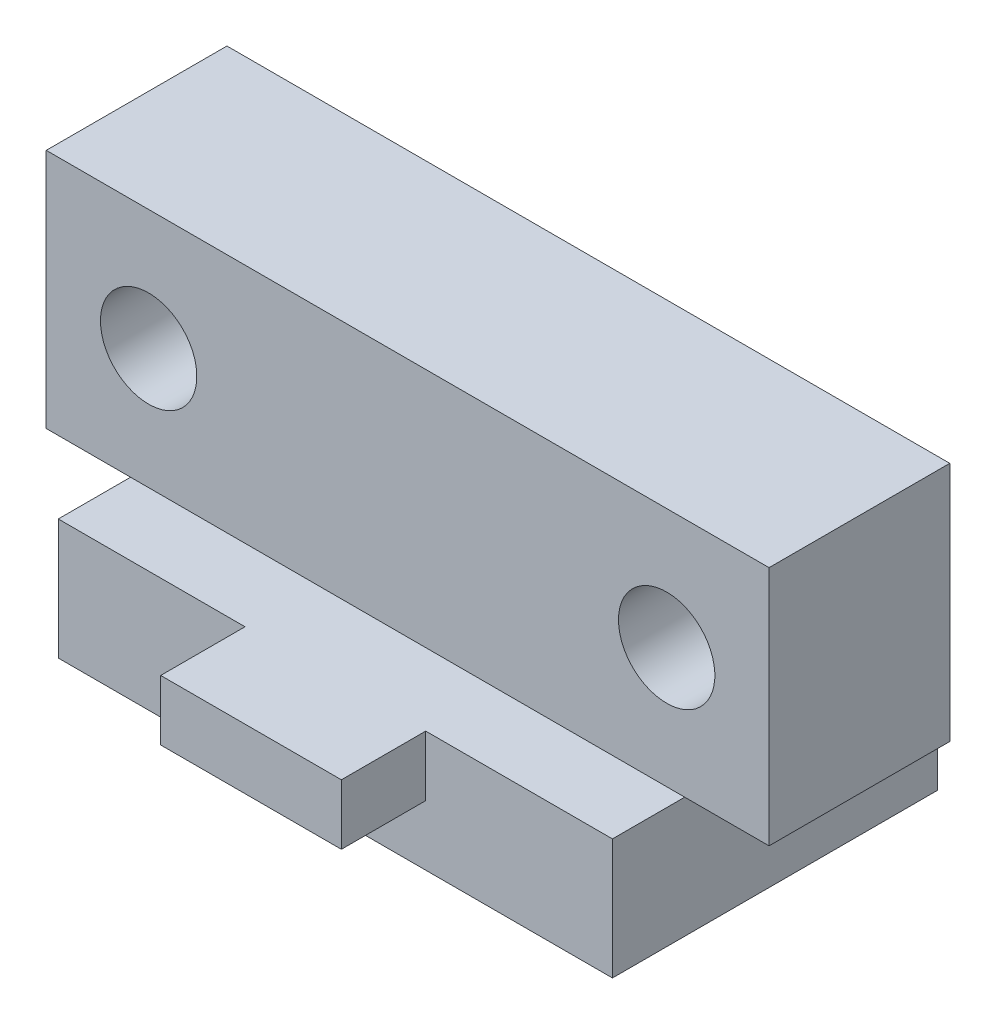
ISO-10303-21;
HEADER;
FILE_DESCRIPTION(('STEP AP214'),'2;1');
FILE_NAME('part.step','',(''),(''),'','','');
FILE_SCHEMA(('AUTOMOTIVE_DESIGN { 1 0 10303 214 1 1 1 1 }'));
ENDSEC;
DATA;
#1=APPLICATION_CONTEXT('core data for automotive mechanical design processes');
#2=APPLICATION_PROTOCOL_DEFINITION('international standard','automotive_design',2000,#1);
#3=PRODUCT_CONTEXT('',#1,'mechanical');
#4=PRODUCT('Part','Part','',(#3));
#5=PRODUCT_RELATED_PRODUCT_CATEGORY('part','',(#4));
#6=PRODUCT_DEFINITION_FORMATION('','',#4);
#7=PRODUCT_DEFINITION_CONTEXT('part definition',#1,'design');
#8=PRODUCT_DEFINITION('design','',#6,#7);
#9=PRODUCT_DEFINITION_SHAPE('','',#8);
#10=(LENGTH_UNIT() NAMED_UNIT(*) SI_UNIT(.MILLI.,.METRE.));
#11=(NAMED_UNIT(*) PLANE_ANGLE_UNIT() SI_UNIT($,.RADIAN.));
#12=(NAMED_UNIT(*) SI_UNIT($,.STERADIAN.) SOLID_ANGLE_UNIT());
#13=UNCERTAINTY_MEASURE_WITH_UNIT(LENGTH_MEASURE(1.E-05),#10,'distance_accuracy_value','');
#14=(GEOMETRIC_REPRESENTATION_CONTEXT(3) GLOBAL_UNCERTAINTY_ASSIGNED_CONTEXT((#13)) GLOBAL_UNIT_ASSIGNED_CONTEXT((#10,
#11,#12)) REPRESENTATION_CONTEXT('',''));
#15=CARTESIAN_POINT('',(0.,0.,0.));
#16=DIRECTION('',(0.,0.,1.));
#17=DIRECTION('',(1.,0.,0.));
#18=AXIS2_PLACEMENT_3D('',#15,#16,#17);
#19=CARTESIAN_POINT('',(0.,10.,0.));
#20=DIRECTION('',(0.,0.,-1.));
#21=DIRECTION('',(-1.,0.,0.));
#22=AXIS2_PLACEMENT_3D('',#19,#20,#21);
#23=PLANE('',#22);
#24=DIRECTION('',(0.,-1.,0.));
#25=VECTOR('',#24,1.);
#26=CARTESIAN_POINT('',(15.5,10.,0.));
#27=LINE('',#26,#25);
#28=CARTESIAN_POINT('',(15.5,10.,0.));
#29=VERTEX_POINT('',#28);
#30=CARTESIAN_POINT('',(15.5,5.,0.));
#31=VERTEX_POINT('',#30);
#32=EDGE_CURVE('E161',#29,#31,#27,.T.);
#33=ORIENTED_EDGE('',*,*,#32,.F.);
#34=DIRECTION('',(1.,0.,0.));
#35=VECTOR('',#34,1.);
#36=CARTESIAN_POINT('',(0.,10.,0.));
#37=LINE('',#36,#35);
#38=CARTESIAN_POINT('',(0.,10.,0.));
#39=VERTEX_POINT('',#38);
#40=EDGE_CURVE('E216',#39,#29,#37,.T.);
#41=ORIENTED_EDGE('',*,*,#40,.F.);
#42=DIRECTION('',(0.,-1.,0.));
#43=VECTOR('',#42,1.);
#44=CARTESIAN_POINT('',(0.,10.,0.));
#45=LINE('',#44,#43);
#46=CARTESIAN_POINT('',(0.,0.,0.));
#47=VERTEX_POINT('',#46);
#48=EDGE_CURVE('E39',#39,#47,#45,.T.);
#49=ORIENTED_EDGE('',*,*,#48,.T.);
#50=DIRECTION('',(1.,0.,0.));
#51=VECTOR('',#50,1.);
#52=CARTESIAN_POINT('',(0.,0.,0.));
#53=LINE('',#52,#51);
#54=CARTESIAN_POINT('',(46.,0.,0.));
#55=VERTEX_POINT('',#54);
#56=EDGE_CURVE('E228',#47,#55,#53,.T.);
#57=ORIENTED_EDGE('',*,*,#56,.T.);
#58=DIRECTION('',(0.,-1.,0.));
#59=VECTOR('',#58,1.);
#60=CARTESIAN_POINT('',(46.,10.,0.));
#61=LINE('',#60,#59);
#62=CARTESIAN_POINT('',(46.,10.,0.));
#63=VERTEX_POINT('',#62);
#64=EDGE_CURVE('E238',#63,#55,#61,.T.);
#65=ORIENTED_EDGE('',*,*,#64,.F.);
#66=CARTESIAN_POINT('',(30.5,10.,0.));
#67=VERTEX_POINT('',#66);
#68=EDGE_CURVE('E60',#67,#63,#37,.T.);
#69=ORIENTED_EDGE('',*,*,#68,.F.);
#70=DIRECTION('',(0.,1.,0.));
#71=VECTOR('',#70,1.);
#72=CARTESIAN_POINT('',(30.5,10.,0.));
#73=LINE('',#72,#71);
#74=CARTESIAN_POINT('',(30.5,5.00000000000001,0.));
#75=VERTEX_POINT('',#74);
#76=EDGE_CURVE('E158',#75,#67,#73,.T.);
#77=ORIENTED_EDGE('',*,*,#76,.F.);
#78=DIRECTION('',(1.,0.,0.));
#79=VECTOR('',#78,1.);
#80=CARTESIAN_POINT('',(15.5,5.,0.));
#81=LINE('',#80,#79);
#82=EDGE_CURVE('E54',#31,#75,#81,.T.);
#83=ORIENTED_EDGE('',*,*,#82,.F.);
#84=EDGE_LOOP('',(#33,#41,#49,#57,#65,#69,#77,#83));
#85=FACE_BOUND('',#84,.T.);
#86=ADVANCED_FACE('F35',(#85),#23,.F.);
#87=CARTESIAN_POINT('',(0.,10.,0.));
#88=DIRECTION('',(0.,-1.,0.));
#89=DIRECTION('',(0.,0.,-1.));
#90=AXIS2_PLACEMENT_3D('',#87,#88,#89);
#91=PLANE('',#90);
#92=DIRECTION('',(-1.,0.,0.));
#93=VECTOR('',#92,1.);
#94=CARTESIAN_POINT('',(-7.,10.,-21.));
#95=LINE('',#94,#93);
#96=CARTESIAN_POINT('',(46.,10.,-21.));
#97=VERTEX_POINT('',#96);
#98=CARTESIAN_POINT('',(0.,10.,-21.));
#99=VERTEX_POINT('',#98);
#100=EDGE_CURVE('E11',#97,#99,#95,.T.);
#101=ORIENTED_EDGE('',*,*,#100,.F.);
#102=DIRECTION('',(0.,0.,-1.));
#103=VECTOR('',#102,1.);
#104=CARTESIAN_POINT('',(46.,10.,0.));
#105=LINE('',#104,#103);
#106=CARTESIAN_POINT('',(46.,10.,-27.));
#107=VERTEX_POINT('',#106);
#108=EDGE_CURVE('E219',#97,#107,#105,.T.);
#109=ORIENTED_EDGE('',*,*,#108,.T.);
#110=DIRECTION('',(-1.,0.,0.));
#111=VECTOR('',#110,1.);
#112=CARTESIAN_POINT('',(0.,10.,-27.));
#113=LINE('',#112,#111);
#114=CARTESIAN_POINT('',(0.,10.,-27.));
#115=VERTEX_POINT('',#114);
#116=EDGE_CURVE('E222',#107,#115,#113,.T.);
#117=ORIENTED_EDGE('',*,*,#116,.T.);
#118=DIRECTION('',(0.,0.,1.));
#119=VECTOR('',#118,1.);
#120=CARTESIAN_POINT('',(0.,10.,0.));
#121=LINE('',#120,#119);
#122=EDGE_CURVE('E211',#115,#99,#121,.T.);
#123=ORIENTED_EDGE('',*,*,#122,.T.);
#124=EDGE_LOOP('',(#101,#109,#117,#123));
#125=FACE_BOUND('',#124,.T.);
#126=ADVANCED_FACE('F308',(#125),#91,.F.);
#127=DIRECTION('',(1.,0.,0.));
#128=VECTOR('',#127,1.);
#129=CARTESIAN_POINT('',(-7.,10.,-6.));
#130=LINE('',#129,#128);
#131=CARTESIAN_POINT('',(0.,10.,-6.));
#132=VERTEX_POINT('',#131);
#133=CARTESIAN_POINT('',(46.,10.,-6.));
#134=VERTEX_POINT('',#133);
#135=EDGE_CURVE('E44',#132,#134,#130,.T.);
#136=ORIENTED_EDGE('',*,*,#135,.F.);
#137=EDGE_CURVE('E215',#132,#39,#121,.T.);
#138=ORIENTED_EDGE('',*,*,#137,.T.);
#139=ORIENTED_EDGE('',*,*,#40,.T.);
#140=DIRECTION('',(0.,0.,-1.));
#141=VECTOR('',#140,1.);
#142=CARTESIAN_POINT('',(15.5,10.,7.));
#143=LINE('',#142,#141);
#144=CARTESIAN_POINT('',(15.5,10.,7.));
#145=VERTEX_POINT('',#144);
#146=EDGE_CURVE('E291',#145,#29,#143,.T.);
#147=ORIENTED_EDGE('',*,*,#146,.F.);
#148=DIRECTION('',(-1.,0.,0.));
#149=VECTOR('',#148,1.);
#150=CARTESIAN_POINT('',(15.5,10.,7.));
#151=LINE('',#150,#149);
#152=CARTESIAN_POINT('',(30.5,10.,7.));
#153=VERTEX_POINT('',#152);
#154=EDGE_CURVE('E154',#153,#145,#151,.T.);
#155=ORIENTED_EDGE('',*,*,#154,.F.);
#156=DIRECTION('',(0.,0.,-1.));
#157=VECTOR('',#156,1.);
#158=CARTESIAN_POINT('',(30.5,10.,7.));
#159=LINE('',#158,#157);
#160=EDGE_CURVE('E167',#153,#67,#159,.T.);
#161=ORIENTED_EDGE('',*,*,#160,.T.);
#162=ORIENTED_EDGE('',*,*,#68,.T.);
#163=EDGE_CURVE('E220',#63,#134,#105,.T.);
#164=ORIENTED_EDGE('',*,*,#163,.T.);
#165=EDGE_LOOP('',(#136,#138,#139,#147,#155,#161,#162,#164));
#166=FACE_BOUND('',#165,.T.);
#167=ADVANCED_FACE('F280',(#166),#91,.F.);
#168=CARTESIAN_POINT('',(0.,10.,0.));
#169=DIRECTION('',(1.,0.,0.));
#170=DIRECTION('',(0.,0.,-1.));
#171=AXIS2_PLACEMENT_3D('',#168,#169,#170);
#172=PLANE('',#171);
#173=DIRECTION('',(0.,0.,1.));
#174=VECTOR('',#173,1.);
#175=CARTESIAN_POINT('',(0.,0.,0.));
#176=LINE('',#175,#174);
#177=CARTESIAN_POINT('',(0.,0.,-27.));
#178=VERTEX_POINT('',#177);
#179=EDGE_CURVE('E210',#178,#47,#176,.T.);
#180=ORIENTED_EDGE('',*,*,#179,.T.);
#181=ORIENTED_EDGE('',*,*,#48,.F.);
#182=ORIENTED_EDGE('',*,*,#137,.F.);
#183=EDGE_CURVE('E214',#99,#132,#121,.T.);
#184=ORIENTED_EDGE('',*,*,#183,.F.);
#185=ORIENTED_EDGE('',*,*,#122,.F.);
#186=DIRECTION('',(0.,-1.,0.));
#187=VECTOR('',#186,1.);
#188=CARTESIAN_POINT('',(0.,10.,-27.));
#189=LINE('',#188,#187);
#190=EDGE_CURVE('E225',#115,#178,#189,.T.);
#191=ORIENTED_EDGE('',*,*,#190,.T.);
#192=EDGE_LOOP('',(#180,#181,#182,#184,#185,#191));
#193=FACE_BOUND('',#192,.T.);
#194=ADVANCED_FACE('F37',(#193),#172,.F.);
#195=CARTESIAN_POINT('',(46.,10.,0.));
#196=DIRECTION('',(-1.,0.,0.));
#197=DIRECTION('',(0.,0.,1.));
#198=AXIS2_PLACEMENT_3D('',#195,#196,#197);
#199=PLANE('',#198);
#200=DIRECTION('',(0.,0.,-1.));
#201=VECTOR('',#200,1.);
#202=CARTESIAN_POINT('',(46.,0.,0.));
#203=LINE('',#202,#201);
#204=CARTESIAN_POINT('',(46.,0.,-27.));
#205=VERTEX_POINT('',#204);
#206=EDGE_CURVE('E230',#55,#205,#203,.T.);
#207=ORIENTED_EDGE('',*,*,#206,.T.);
#208=DIRECTION('',(0.,-1.,0.));
#209=VECTOR('',#208,1.);
#210=CARTESIAN_POINT('',(46.,10.,-27.));
#211=LINE('',#210,#209);
#212=EDGE_CURVE('E236',#107,#205,#211,.T.);
#213=ORIENTED_EDGE('',*,*,#212,.F.);
#214=ORIENTED_EDGE('',*,*,#108,.F.);
#215=EDGE_CURVE('E223',#134,#97,#105,.T.);
#216=ORIENTED_EDGE('',*,*,#215,.F.);
#217=ORIENTED_EDGE('',*,*,#163,.F.);
#218=ORIENTED_EDGE('',*,*,#64,.T.);
#219=EDGE_LOOP('',(#207,#213,#214,#216,#217,#218));
#220=FACE_BOUND('',#219,.T.);
#221=ADVANCED_FACE('F286',(#220),#199,.F.);
#222=CARTESIAN_POINT('',(0.,10.,-27.));
#223=DIRECTION('',(0.,0.,1.));
#224=DIRECTION('',(1.,0.,0.));
#225=AXIS2_PLACEMENT_3D('',#222,#223,#224);
#226=PLANE('',#225);
#227=DIRECTION('',(-1.,0.,0.));
#228=VECTOR('',#227,1.);
#229=CARTESIAN_POINT('',(0.,0.,-27.));
#230=LINE('',#229,#228);
#231=EDGE_CURVE('E232',#205,#178,#230,.T.);
#232=ORIENTED_EDGE('',*,*,#231,.T.);
#233=ORIENTED_EDGE('',*,*,#190,.F.);
#234=ORIENTED_EDGE('',*,*,#116,.F.);
#235=ORIENTED_EDGE('',*,*,#212,.T.);
#236=EDGE_LOOP('',(#232,#233,#234,#235));
#237=FACE_BOUND('',#236,.T.);
#238=ADVANCED_FACE('F317',(#237),#226,.F.);
#239=CARTESIAN_POINT('',(0.,0.,0.));
#240=DIRECTION('',(0.,-1.,0.));
#241=DIRECTION('',(0.,0.,-1.));
#242=AXIS2_PLACEMENT_3D('',#239,#240,#241);
#243=PLANE('',#242);
#244=ORIENTED_EDGE('',*,*,#179,.F.);
#245=ORIENTED_EDGE('',*,*,#231,.F.);
#246=ORIENTED_EDGE('',*,*,#206,.F.);
#247=ORIENTED_EDGE('',*,*,#56,.F.);
#248=EDGE_LOOP('',(#244,#245,#246,#247));
#249=FACE_BOUND('',#248,.T.);
#250=ADVANCED_FACE('F285',(#249),#243,.T.);
#251=CARTESIAN_POINT('',(0.,10.,0.));
#252=DIRECTION('',(0.,1.,0.));
#253=DIRECTION('',(0.,0.,1.));
#254=AXIS2_PLACEMENT_3D('',#251,#252,#253);
#255=PLANE('',#254);
#256=CARTESIAN_POINT('',(-7.,10.,-21.));
#257=VERTEX_POINT('',#256);
#258=EDGE_CURVE('E47',#99,#257,#95,.T.);
#259=ORIENTED_EDGE('',*,*,#258,.F.);
#260=ORIENTED_EDGE('',*,*,#183,.T.);
#261=CARTESIAN_POINT('',(-7.,10.,-6.));
#262=VERTEX_POINT('',#261);
#263=EDGE_CURVE('E193',#262,#132,#130,.T.);
#264=ORIENTED_EDGE('',*,*,#263,.F.);
#265=DIRECTION('',(0.,0.,1.));
#266=VECTOR('',#265,1.);
#267=CARTESIAN_POINT('',(-7.,10.,-21.));
#268=LINE('',#267,#266);
#269=EDGE_CURVE('E179',#257,#262,#268,.T.);
#270=ORIENTED_EDGE('',*,*,#269,.F.);
#271=EDGE_LOOP('',(#259,#260,#264,#270));
#272=FACE_BOUND('',#271,.T.);
#273=ADVANCED_FACE('F274',(#272),#255,.F.);
#274=CARTESIAN_POINT('',(53.,10.,-6.));
#275=VERTEX_POINT('',#274);
#276=EDGE_CURVE('E192',#134,#275,#130,.T.);
#277=ORIENTED_EDGE('',*,*,#276,.F.);
#278=ORIENTED_EDGE('',*,*,#215,.T.);
#279=CARTESIAN_POINT('',(53.,10.,-21.));
#280=VERTEX_POINT('',#279);
#281=EDGE_CURVE('E46',#280,#97,#95,.T.);
#282=ORIENTED_EDGE('',*,*,#281,.F.);
#283=DIRECTION('',(0.,0.,-1.));
#284=VECTOR('',#283,1.);
#285=CARTESIAN_POINT('',(53.,10.,-21.));
#286=LINE('',#285,#284);
#287=EDGE_CURVE('E196',#275,#280,#286,.T.);
#288=ORIENTED_EDGE('',*,*,#287,.F.);
#289=EDGE_LOOP('',(#277,#278,#282,#288));
#290=FACE_BOUND('',#289,.T.);
#291=ADVANCED_FACE('F259',(#290),#255,.F.);
#292=CARTESIAN_POINT('',(-7.,30.,-21.));
#293=DIRECTION('',(1.,0.,0.));
#294=DIRECTION('',(0.,0.,-1.));
#295=AXIS2_PLACEMENT_3D('',#292,#293,#294);
#296=PLANE('',#295);
#297=ORIENTED_EDGE('',*,*,#269,.T.);
#298=DIRECTION('',(0.,-1.,0.));
#299=VECTOR('',#298,1.);
#300=CARTESIAN_POINT('',(-7.,30.,-6.));
#301=LINE('',#300,#299);
#302=CARTESIAN_POINT('',(-7.,30.,-6.));
#303=VERTEX_POINT('',#302);
#304=EDGE_CURVE('E207',#303,#262,#301,.T.);
#305=ORIENTED_EDGE('',*,*,#304,.F.);
#306=DIRECTION('',(0.,0.,1.));
#307=VECTOR('',#306,1.);
#308=CARTESIAN_POINT('',(-7.,30.,-21.));
#309=LINE('',#308,#307);
#310=CARTESIAN_POINT('',(-7.,30.,-21.));
#311=VERTEX_POINT('',#310);
#312=EDGE_CURVE('E180',#311,#303,#309,.T.);
#313=ORIENTED_EDGE('',*,*,#312,.F.);
#314=DIRECTION('',(0.,-1.,0.));
#315=VECTOR('',#314,1.);
#316=CARTESIAN_POINT('',(-7.,30.,-21.));
#317=LINE('',#316,#315);
#318=EDGE_CURVE('E189',#311,#257,#317,.T.);
#319=ORIENTED_EDGE('',*,*,#318,.T.);
#320=EDGE_LOOP('',(#297,#305,#313,#319));
#321=FACE_BOUND('',#320,.T.);
#322=ADVANCED_FACE('F271',(#321),#296,.F.);
#323=CARTESIAN_POINT('',(-7.,30.,-6.));
#324=DIRECTION('',(0.,0.,-1.));
#325=DIRECTION('',(-1.,0.,0.));
#326=AXIS2_PLACEMENT_3D('',#323,#324,#325);
#327=PLANE('',#326);
#328=CARTESIAN_POINT('',(44.5,20.,-6.));
#329=DIRECTION('',(0.,0.,-1.));
#330=DIRECTION('',(-1.,0.,0.));
#331=AXIS2_PLACEMENT_3D('',#328,#329,#330);
#332=CIRCLE('',#331,4.);
#333=CARTESIAN_POINT('',(40.5,20.,-6.));
#334=VERTEX_POINT('',#333);
#335=EDGE_CURVE('E176',#334,#334,#332,.T.);
#336=ORIENTED_EDGE('',*,*,#335,.T.);
#337=EDGE_LOOP('',(#336));
#338=FACE_BOUND('',#337,.T.);
#339=CARTESIAN_POINT('',(1.5,20.,-6.));
#340=DIRECTION('',(0.,0.,-1.));
#341=DIRECTION('',(-1.,0.,0.));
#342=AXIS2_PLACEMENT_3D('',#339,#340,#341);
#343=CIRCLE('',#342,4.);
#344=CARTESIAN_POINT('',(-2.5,20.,-6.));
#345=VERTEX_POINT('',#344);
#346=EDGE_CURVE('E172',#345,#345,#343,.T.);
#347=ORIENTED_EDGE('',*,*,#346,.T.);
#348=EDGE_LOOP('',(#347));
#349=FACE_BOUND('',#348,.T.);
#350=ORIENTED_EDGE('',*,*,#263,.T.);
#351=ORIENTED_EDGE('',*,*,#135,.T.);
#352=ORIENTED_EDGE('',*,*,#276,.T.);
#353=DIRECTION('',(0.,-1.,0.));
#354=VECTOR('',#353,1.);
#355=CARTESIAN_POINT('',(53.,30.,-6.));
#356=LINE('',#355,#354);
#357=CARTESIAN_POINT('',(53.,30.,-6.));
#358=VERTEX_POINT('',#357);
#359=EDGE_CURVE('E204',#358,#275,#356,.T.);
#360=ORIENTED_EDGE('',*,*,#359,.F.);
#361=DIRECTION('',(1.,0.,0.));
#362=VECTOR('',#361,1.);
#363=CARTESIAN_POINT('',(-7.,30.,-6.));
#364=LINE('',#363,#362);
#365=EDGE_CURVE('E183',#303,#358,#364,.T.);
#366=ORIENTED_EDGE('',*,*,#365,.F.);
#367=ORIENTED_EDGE('',*,*,#304,.T.);
#368=EDGE_LOOP('',(#350,#351,#352,#360,#366,#367));
#369=FACE_BOUND('',#368,.T.);
#370=ADVANCED_FACE('F250',(#338,#349,#369),#327,.F.);
#371=CARTESIAN_POINT('',(53.,30.,-21.));
#372=DIRECTION('',(-1.,0.,0.));
#373=DIRECTION('',(0.,0.,1.));
#374=AXIS2_PLACEMENT_3D('',#371,#372,#373);
#375=PLANE('',#374);
#376=ORIENTED_EDGE('',*,*,#287,.T.);
#377=DIRECTION('',(0.,-1.,0.));
#378=VECTOR('',#377,1.);
#379=CARTESIAN_POINT('',(53.,30.,-21.));
#380=LINE('',#379,#378);
#381=CARTESIAN_POINT('',(53.,30.,-21.));
#382=VERTEX_POINT('',#381);
#383=EDGE_CURVE('E201',#382,#280,#380,.T.);
#384=ORIENTED_EDGE('',*,*,#383,.F.);
#385=DIRECTION('',(0.,0.,-1.));
#386=VECTOR('',#385,1.);
#387=CARTESIAN_POINT('',(53.,30.,-21.));
#388=LINE('',#387,#386);
#389=EDGE_CURVE('E185',#358,#382,#388,.T.);
#390=ORIENTED_EDGE('',*,*,#389,.F.);
#391=ORIENTED_EDGE('',*,*,#359,.T.);
#392=EDGE_LOOP('',(#376,#384,#390,#391));
#393=FACE_BOUND('',#392,.T.);
#394=ADVANCED_FACE('F256',(#393),#375,.F.);
#395=CARTESIAN_POINT('',(-7.,30.,-21.));
#396=DIRECTION('',(0.,0.,1.));
#397=DIRECTION('',(1.,0.,0.));
#398=AXIS2_PLACEMENT_3D('',#395,#396,#397);
#399=PLANE('',#398);
#400=CARTESIAN_POINT('',(44.5,20.,-21.));
#401=DIRECTION('',(0.,0.,-1.));
#402=DIRECTION('',(-1.,0.,0.));
#403=AXIS2_PLACEMENT_3D('',#400,#401,#402);
#404=CIRCLE('',#403,4.);
#405=CARTESIAN_POINT('',(40.5,20.,-21.));
#406=VERTEX_POINT('',#405);
#407=EDGE_CURVE('E165',#406,#406,#404,.T.);
#408=ORIENTED_EDGE('',*,*,#407,.F.);
#409=EDGE_LOOP('',(#408));
#410=FACE_BOUND('',#409,.T.);
#411=CARTESIAN_POINT('',(1.5,20.,-21.));
#412=DIRECTION('',(0.,0.,-1.));
#413=DIRECTION('',(1.,0.,0.));
#414=AXIS2_PLACEMENT_3D('',#411,#412,#413);
#415=CIRCLE('',#414,4.);
#416=CARTESIAN_POINT('',(5.5,20.,-21.));
#417=VERTEX_POINT('',#416);
#418=EDGE_CURVE('E162',#417,#417,#415,.T.);
#419=ORIENTED_EDGE('',*,*,#418,.F.);
#420=EDGE_LOOP('',(#419));
#421=FACE_BOUND('',#420,.T.);
#422=ORIENTED_EDGE('',*,*,#281,.T.);
#423=ORIENTED_EDGE('',*,*,#100,.T.);
#424=ORIENTED_EDGE('',*,*,#258,.T.);
#425=ORIENTED_EDGE('',*,*,#318,.F.);
#426=DIRECTION('',(-1.,0.,0.));
#427=VECTOR('',#426,1.);
#428=CARTESIAN_POINT('',(-7.,30.,-21.));
#429=LINE('',#428,#427);
#430=EDGE_CURVE('E187',#382,#311,#429,.T.);
#431=ORIENTED_EDGE('',*,*,#430,.F.);
#432=ORIENTED_EDGE('',*,*,#383,.T.);
#433=EDGE_LOOP('',(#422,#423,#424,#425,#431,#432));
#434=FACE_BOUND('',#433,.T.);
#435=ADVANCED_FACE('F262',(#410,#421,#434),#399,.F.);
#436=CARTESIAN_POINT('',(0.,30.,0.));
#437=DIRECTION('',(0.,1.,0.));
#438=DIRECTION('',(0.,0.,1.));
#439=AXIS2_PLACEMENT_3D('',#436,#437,#438);
#440=PLANE('',#439);
#441=ORIENTED_EDGE('',*,*,#312,.T.);
#442=ORIENTED_EDGE('',*,*,#365,.T.);
#443=ORIENTED_EDGE('',*,*,#389,.T.);
#444=ORIENTED_EDGE('',*,*,#430,.T.);
#445=EDGE_LOOP('',(#441,#442,#443,#444));
#446=FACE_BOUND('',#445,.T.);
#447=ADVANCED_FACE('F267',(#446),#440,.T.);
#448=CARTESIAN_POINT('',(1.5,20.,0.));
#449=DIRECTION('',(0.,0.,-1.));
#450=DIRECTION('',(-1.,0.,0.));
#451=AXIS2_PLACEMENT_3D('',#448,#449,#450);
#452=CYLINDRICAL_SURFACE('',#451,4.);
#453=ORIENTED_EDGE('',*,*,#418,.T.);
#454=EDGE_LOOP('',(#453));
#455=FACE_BOUND('',#454,.T.);
#456=ORIENTED_EDGE('',*,*,#346,.F.);
#457=EDGE_LOOP('',(#456));
#458=FACE_BOUND('',#457,.T.);
#459=ADVANCED_FACE('F337',(#455,#458),#452,.F.);
#460=CARTESIAN_POINT('',(44.5,20.,0.));
#461=DIRECTION('',(0.,0.,-1.));
#462=DIRECTION('',(-1.,0.,0.));
#463=AXIS2_PLACEMENT_3D('',#460,#461,#462);
#464=CYLINDRICAL_SURFACE('',#463,4.);
#465=ORIENTED_EDGE('',*,*,#407,.T.);
#466=EDGE_LOOP('',(#465));
#467=FACE_BOUND('',#466,.T.);
#468=ORIENTED_EDGE('',*,*,#335,.F.);
#469=EDGE_LOOP('',(#468));
#470=FACE_BOUND('',#469,.T.);
#471=ADVANCED_FACE('F340',(#467,#470),#464,.F.);
#472=CARTESIAN_POINT('',(15.5,10.,7.));
#473=DIRECTION('',(1.,0.,0.));
#474=DIRECTION('',(0.,1.,0.));
#475=AXIS2_PLACEMENT_3D('',#472,#473,#474);
#476=PLANE('',#475);
#477=ORIENTED_EDGE('',*,*,#32,.T.);
#478=DIRECTION('',(0.,0.,-1.));
#479=VECTOR('',#478,1.);
#480=CARTESIAN_POINT('',(15.5,5.,7.));
#481=LINE('',#480,#479);
#482=CARTESIAN_POINT('',(15.5,5.,7.));
#483=VERTEX_POINT('',#482);
#484=EDGE_CURVE('E142',#483,#31,#481,.T.);
#485=ORIENTED_EDGE('',*,*,#484,.F.);
#486=DIRECTION('',(0.,-1.,0.));
#487=VECTOR('',#486,1.);
#488=CARTESIAN_POINT('',(15.5,10.,7.));
#489=LINE('',#488,#487);
#490=EDGE_CURVE('E149',#145,#483,#489,.T.);
#491=ORIENTED_EDGE('',*,*,#490,.F.);
#492=ORIENTED_EDGE('',*,*,#146,.T.);
#493=EDGE_LOOP('',(#477,#485,#491,#492));
#494=FACE_BOUND('',#493,.T.);
#495=ADVANCED_FACE('F160',(#494),#476,.F.);
#496=CARTESIAN_POINT('',(15.5,5.,7.));
#497=DIRECTION('',(0.,1.,0.));
#498=DIRECTION('',(-1.,0.,0.));
#499=AXIS2_PLACEMENT_3D('',#496,#497,#498);
#500=PLANE('',#499);
#501=ORIENTED_EDGE('',*,*,#82,.T.);
#502=DIRECTION('',(0.,0.,-1.));
#503=VECTOR('',#502,1.);
#504=CARTESIAN_POINT('',(30.5,5.00000000000001,7.));
#505=LINE('',#504,#503);
#506=CARTESIAN_POINT('',(30.5,5.00000000000001,7.));
#507=VERTEX_POINT('',#506);
#508=EDGE_CURVE('E145',#507,#75,#505,.T.);
#509=ORIENTED_EDGE('',*,*,#508,.F.);
#510=DIRECTION('',(1.,0.,0.));
#511=VECTOR('',#510,1.);
#512=CARTESIAN_POINT('',(15.5,5.,7.));
#513=LINE('',#512,#511);
#514=EDGE_CURVE('E138',#483,#507,#513,.T.);
#515=ORIENTED_EDGE('',*,*,#514,.F.);
#516=ORIENTED_EDGE('',*,*,#484,.T.);
#517=EDGE_LOOP('',(#501,#509,#515,#516));
#518=FACE_BOUND('',#517,.T.);
#519=ADVANCED_FACE('F140',(#518),#500,.F.);
#520=CARTESIAN_POINT('',(30.5,10.,7.));
#521=DIRECTION('',(-1.,0.,0.));
#522=DIRECTION('',(0.,0.,1.));
#523=AXIS2_PLACEMENT_3D('',#520,#521,#522);
#524=PLANE('',#523);
#525=ORIENTED_EDGE('',*,*,#76,.T.);
#526=ORIENTED_EDGE('',*,*,#160,.F.);
#527=DIRECTION('',(0.,1.,0.));
#528=VECTOR('',#527,1.);
#529=CARTESIAN_POINT('',(30.5,10.,7.));
#530=LINE('',#529,#528);
#531=EDGE_CURVE('E148',#507,#153,#530,.T.);
#532=ORIENTED_EDGE('',*,*,#531,.F.);
#533=ORIENTED_EDGE('',*,*,#508,.T.);
#534=EDGE_LOOP('',(#525,#526,#532,#533));
#535=FACE_BOUND('',#534,.T.);
#536=ADVANCED_FACE('F298',(#535),#524,.F.);
#537=CARTESIAN_POINT('',(0.,0.,7.));
#538=DIRECTION('',(0.,0.,1.));
#539=DIRECTION('',(1.,0.,0.));
#540=AXIS2_PLACEMENT_3D('',#537,#538,#539);
#541=PLANE('',#540);
#542=ORIENTED_EDGE('',*,*,#490,.T.);
#543=ORIENTED_EDGE('',*,*,#514,.T.);
#544=ORIENTED_EDGE('',*,*,#531,.T.);
#545=ORIENTED_EDGE('',*,*,#154,.T.);
#546=EDGE_LOOP('',(#542,#543,#544,#545));
#547=FACE_BOUND('',#546,.T.);
#548=ADVANCED_FACE('F152',(#547),#541,.T.);
#549=CLOSED_SHELL('',(#86,#126,#167,#194,#221,#238,#250,#273,#291,#322,#370,#394,#435,#447,#459,
#471,#495,#519,#536,#548));
#550=MANIFOLD_SOLID_BREP('B2',#549);
#551=ADVANCED_BREP_SHAPE_REPRESENTATION('',(#18,#550),#14);
#552=SHAPE_DEFINITION_REPRESENTATION(#9,#551);
ENDSEC;
END-ISO-10303-21;
